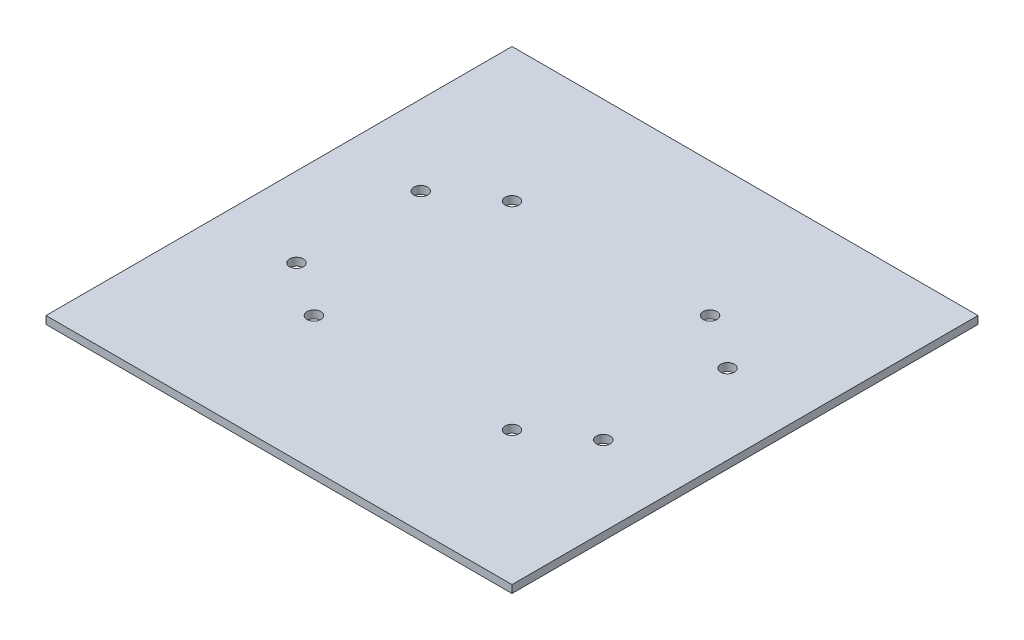
ISO-10303-21;
HEADER;
FILE_DESCRIPTION(('STEP AP214'),'2;1');
FILE_NAME('part.step','',(''),(''),'','','');
FILE_SCHEMA(('AUTOMOTIVE_DESIGN { 1 0 10303 214 1 1 1 1 }'));
ENDSEC;
DATA;
#1=APPLICATION_CONTEXT('core data for automotive mechanical design processes');
#2=APPLICATION_PROTOCOL_DEFINITION('international standard','automotive_design',2000,#1);
#3=PRODUCT_CONTEXT('',#1,'mechanical');
#4=PRODUCT('Part','Part','',(#3));
#5=PRODUCT_RELATED_PRODUCT_CATEGORY('part','',(#4));
#6=PRODUCT_DEFINITION_FORMATION('','',#4);
#7=PRODUCT_DEFINITION_CONTEXT('part definition',#1,'design');
#8=PRODUCT_DEFINITION('design','',#6,#7);
#9=PRODUCT_DEFINITION_SHAPE('','',#8);
#10=(LENGTH_UNIT() NAMED_UNIT(*) SI_UNIT(.MILLI.,.METRE.));
#11=(NAMED_UNIT(*) PLANE_ANGLE_UNIT() SI_UNIT($,.RADIAN.));
#12=(NAMED_UNIT(*) SI_UNIT($,.STERADIAN.) SOLID_ANGLE_UNIT());
#13=UNCERTAINTY_MEASURE_WITH_UNIT(LENGTH_MEASURE(1.E-05),#10,'distance_accuracy_value','');
#14=(GEOMETRIC_REPRESENTATION_CONTEXT(3) GLOBAL_UNCERTAINTY_ASSIGNED_CONTEXT((#13)) GLOBAL_UNIT_ASSIGNED_CONTEXT((#10,
#11,#12)) REPRESENTATION_CONTEXT('',''));
#15=CARTESIAN_POINT('',(0.,0.,0.));
#16=DIRECTION('',(0.,0.,1.));
#17=DIRECTION('',(1.,0.,0.));
#18=AXIS2_PLACEMENT_3D('',#15,#16,#17);
#19=CARTESIAN_POINT('',(44.8799955021159,2.,-74.7331424372196));
#20=DIRECTION('',(1.,0.,0.));
#21=DIRECTION('',(0.,0.,-1.));
#22=AXIS2_PLACEMENT_3D('',#19,#20,#21);
#23=PLANE('',#22);
#24=DIRECTION('',(0.,0.,1.));
#25=VECTOR('',#24,1.);
#26=CARTESIAN_POINT('',(44.8799955021159,0.,-74.7331424372196));
#27=LINE('',#26,#25);
#28=CARTESIAN_POINT('',(44.8799955021159,0.,-74.7331424372196));
#29=VERTEX_POINT('',#28);
#30=CARTESIAN_POINT('',(44.879995502116,0.,45.2668575627803));
#31=VERTEX_POINT('',#30);
#32=EDGE_CURVE('E95',#29,#31,#27,.T.);
#33=ORIENTED_EDGE('',*,*,#32,.T.);
#34=DIRECTION('',(0.,-1.,0.));
#35=VECTOR('',#34,1.);
#36=CARTESIAN_POINT('',(44.879995502116,2.,45.2668575627803));
#37=LINE('',#36,#35);
#38=CARTESIAN_POINT('',(44.879995502116,2.,45.2668575627803));
#39=VERTEX_POINT('',#38);
#40=EDGE_CURVE('E11',#39,#31,#37,.T.);
#41=ORIENTED_EDGE('',*,*,#40,.F.);
#42=DIRECTION('',(0.,0.,1.));
#43=VECTOR('',#42,1.);
#44=CARTESIAN_POINT('',(44.8799955021159,2.,-74.7331424372196));
#45=LINE('',#44,#43);
#46=CARTESIAN_POINT('',(44.8799955021159,2.,-74.7331424372196));
#47=VERTEX_POINT('',#46);
#48=EDGE_CURVE('E83',#47,#39,#45,.T.);
#49=ORIENTED_EDGE('',*,*,#48,.F.);
#50=DIRECTION('',(0.,-1.,0.));
#51=VECTOR('',#50,1.);
#52=CARTESIAN_POINT('',(44.8799955021159,2.,-74.7331424372196));
#53=LINE('',#52,#51);
#54=EDGE_CURVE('E91',#47,#29,#53,.T.);
#55=ORIENTED_EDGE('',*,*,#54,.T.);
#56=EDGE_LOOP('',(#33,#41,#49,#55));
#57=FACE_BOUND('',#56,.T.);
#58=ADVANCED_FACE('F32',(#57),#23,.F.);
#59=CARTESIAN_POINT('',(44.879995502116,2.,45.2668575627803));
#60=DIRECTION('',(0.,0.,-1.));
#61=DIRECTION('',(-1.,0.,0.));
#62=AXIS2_PLACEMENT_3D('',#59,#60,#61);
#63=PLANE('',#62);
#64=DIRECTION('',(1.,0.,0.));
#65=VECTOR('',#64,1.);
#66=CARTESIAN_POINT('',(44.879995502116,0.,45.2668575627803));
#67=LINE('',#66,#65);
#68=CARTESIAN_POINT('',(164.879995502116,0.,45.2668575627803));
#69=VERTEX_POINT('',#68);
#70=EDGE_CURVE('E87',#31,#69,#67,.T.);
#71=ORIENTED_EDGE('',*,*,#70,.T.);
#72=DIRECTION('',(0.,-1.,0.));
#73=VECTOR('',#72,1.);
#74=CARTESIAN_POINT('',(164.879995502116,2.,45.2668575627803));
#75=LINE('',#74,#73);
#76=CARTESIAN_POINT('',(164.879995502116,2.,45.2668575627803));
#77=VERTEX_POINT('',#76);
#78=EDGE_CURVE('E40',#77,#69,#75,.T.);
#79=ORIENTED_EDGE('',*,*,#78,.F.);
#80=DIRECTION('',(1.,0.,0.));
#81=VECTOR('',#80,1.);
#82=CARTESIAN_POINT('',(44.879995502116,2.,45.2668575627803));
#83=LINE('',#82,#81);
#84=EDGE_CURVE('E78',#39,#77,#83,.T.);
#85=ORIENTED_EDGE('',*,*,#84,.F.);
#86=ORIENTED_EDGE('',*,*,#40,.T.);
#87=EDGE_LOOP('',(#71,#79,#85,#86));
#88=FACE_BOUND('',#87,.T.);
#89=ADVANCED_FACE('F86',(#88),#63,.F.);
#90=CARTESIAN_POINT('',(164.879995502116,2.,-74.7331424372197));
#91=DIRECTION('',(-1.,0.,0.));
#92=DIRECTION('',(0.,0.,1.));
#93=AXIS2_PLACEMENT_3D('',#90,#91,#92);
#94=PLANE('',#93);
#95=DIRECTION('',(0.,0.,-1.));
#96=VECTOR('',#95,1.);
#97=CARTESIAN_POINT('',(164.879995502116,0.,-74.7331424372197));
#98=LINE('',#97,#96);
#99=CARTESIAN_POINT('',(164.879995502116,0.,-74.7331424372197));
#100=VERTEX_POINT('',#99);
#101=EDGE_CURVE('E65',#69,#100,#98,.T.);
#102=ORIENTED_EDGE('',*,*,#101,.T.);
#103=DIRECTION('',(0.,-1.,0.));
#104=VECTOR('',#103,1.);
#105=CARTESIAN_POINT('',(164.879995502116,2.,-74.7331424372197));
#106=LINE('',#105,#104);
#107=CARTESIAN_POINT('',(164.879995502116,2.,-74.7331424372197));
#108=VERTEX_POINT('',#107);
#109=EDGE_CURVE('E88',#108,#100,#106,.T.);
#110=ORIENTED_EDGE('',*,*,#109,.F.);
#111=DIRECTION('',(0.,0.,-1.));
#112=VECTOR('',#111,1.);
#113=CARTESIAN_POINT('',(164.879995502116,2.,-74.7331424372197));
#114=LINE('',#113,#112);
#115=EDGE_CURVE('E81',#77,#108,#114,.T.);
#116=ORIENTED_EDGE('',*,*,#115,.F.);
#117=ORIENTED_EDGE('',*,*,#78,.T.);
#118=EDGE_LOOP('',(#102,#110,#116,#117));
#119=FACE_BOUND('',#118,.T.);
#120=ADVANCED_FACE('F89',(#119),#94,.F.);
#121=CARTESIAN_POINT('',(44.8799955021159,2.,-74.7331424372196));
#122=DIRECTION('',(0.,0.,1.));
#123=DIRECTION('',(1.,0.,0.));
#124=AXIS2_PLACEMENT_3D('',#121,#122,#123);
#125=PLANE('',#124);
#126=DIRECTION('',(-1.,0.,0.));
#127=VECTOR('',#126,1.);
#128=CARTESIAN_POINT('',(44.8799955021159,0.,-74.7331424372196));
#129=LINE('',#128,#127);
#130=EDGE_CURVE('E71',#100,#29,#129,.T.);
#131=ORIENTED_EDGE('',*,*,#130,.T.);
#132=ORIENTED_EDGE('',*,*,#54,.F.);
#133=DIRECTION('',(-1.,0.,0.));
#134=VECTOR('',#133,1.);
#135=CARTESIAN_POINT('',(44.8799955021159,2.,-74.7331424372196));
#136=LINE('',#135,#134);
#137=EDGE_CURVE('E48',#108,#47,#136,.T.);
#138=ORIENTED_EDGE('',*,*,#137,.F.);
#139=ORIENTED_EDGE('',*,*,#109,.T.);
#140=EDGE_LOOP('',(#131,#132,#138,#139));
#141=FACE_BOUND('',#140,.T.);
#142=ADVANCED_FACE('F103',(#141),#125,.F.);
#143=CARTESIAN_POINT('',(0.,2.,0.));
#144=DIRECTION('',(0.,1.,0.));
#145=DIRECTION('',(0.,0.,1.));
#146=AXIS2_PLACEMENT_3D('',#143,#144,#145);
#147=PLANE('',#146);
#148=CARTESIAN_POINT('',(130.379995502116,2.,-40.2331424372197));
#149=DIRECTION('',(0.,1.,0.));
#150=DIRECTION('',(0.,0.,1.));
#151=AXIS2_PLACEMENT_3D('',#148,#149,#150);
#152=CIRCLE('',#151,1.77499999999999);
#153=CARTESIAN_POINT('',(130.379995502116,2.,-38.4581424372197));
#154=VERTEX_POINT('',#153);
#155=EDGE_CURVE('E151',#154,#154,#152,.T.);
#156=ORIENTED_EDGE('',*,*,#155,.F.);
#157=EDGE_LOOP('',(#156));
#158=FACE_BOUND('',#157,.T.);
#159=CARTESIAN_POINT('',(130.379995502116,2.,10.7668575627803));
#160=DIRECTION('',(0.,1.,0.));
#161=DIRECTION('',(0.,0.,1.));
#162=AXIS2_PLACEMENT_3D('',#159,#160,#161);
#163=CIRCLE('',#162,1.775);
#164=CARTESIAN_POINT('',(130.379995502116,2.,12.5418575627803));
#165=VERTEX_POINT('',#164);
#166=EDGE_CURVE('E145',#165,#165,#163,.T.);
#167=ORIENTED_EDGE('',*,*,#166,.F.);
#168=EDGE_LOOP('',(#167));
#169=FACE_BOUND('',#168,.T.);
#170=CARTESIAN_POINT('',(79.3799955021159,2.,-40.2331424372197));
#171=DIRECTION('',(0.,1.,0.));
#172=DIRECTION('',(0.,0.,1.));
#173=AXIS2_PLACEMENT_3D('',#170,#171,#172);
#174=CIRCLE('',#173,1.77499999999999);
#175=CARTESIAN_POINT('',(79.3799955021159,2.,-38.4581424372197));
#176=VERTEX_POINT('',#175);
#177=EDGE_CURVE('E139',#176,#176,#174,.T.);
#178=ORIENTED_EDGE('',*,*,#177,.F.);
#179=EDGE_LOOP('',(#178));
#180=FACE_BOUND('',#179,.T.);
#181=CARTESIAN_POINT('',(79.3799955021159,2.,10.7668575627803));
#182=DIRECTION('',(0.,1.,0.));
#183=DIRECTION('',(0.,0.,1.));
#184=AXIS2_PLACEMENT_3D('',#181,#182,#183);
#185=CIRCLE('',#184,1.775);
#186=CARTESIAN_POINT('',(79.3799955021159,2.,12.5418575627803));
#187=VERTEX_POINT('',#186);
#188=EDGE_CURVE('E133',#187,#187,#185,.T.);
#189=ORIENTED_EDGE('',*,*,#188,.F.);
#190=EDGE_LOOP('',(#189));
#191=FACE_BOUND('',#190,.T.);
#192=CARTESIAN_POINT('',(144.379995502116,2.,-30.7331424372197));
#193=DIRECTION('',(0.,1.,0.));
#194=DIRECTION('',(0.,0.,1.));
#195=AXIS2_PLACEMENT_3D('',#192,#193,#194);
#196=CIRCLE('',#195,1.77499999999999);
#197=CARTESIAN_POINT('',(144.379995502116,2.,-28.9581424372197));
#198=VERTEX_POINT('',#197);
#199=EDGE_CURVE('E127',#198,#198,#196,.T.);
#200=ORIENTED_EDGE('',*,*,#199,.F.);
#201=EDGE_LOOP('',(#200));
#202=FACE_BOUND('',#201,.T.);
#203=CARTESIAN_POINT('',(144.379995502116,2.,1.2668575627803));
#204=DIRECTION('',(0.,1.,0.));
#205=DIRECTION('',(0.,0.,1.));
#206=AXIS2_PLACEMENT_3D('',#203,#204,#205);
#207=CIRCLE('',#206,1.775);
#208=CARTESIAN_POINT('',(144.379995502116,2.,3.0418575627803));
#209=VERTEX_POINT('',#208);
#210=EDGE_CURVE('E121',#209,#209,#207,.T.);
#211=ORIENTED_EDGE('',*,*,#210,.F.);
#212=EDGE_LOOP('',(#211));
#213=FACE_BOUND('',#212,.T.);
#214=CARTESIAN_POINT('',(65.3799955021159,2.,1.2668575627803));
#215=DIRECTION('',(0.,1.,0.));
#216=DIRECTION('',(0.,0.,1.));
#217=AXIS2_PLACEMENT_3D('',#214,#215,#216);
#218=CIRCLE('',#217,1.775);
#219=CARTESIAN_POINT('',(65.3799955021159,2.,3.0418575627803));
#220=VERTEX_POINT('',#219);
#221=EDGE_CURVE('E115',#220,#220,#218,.T.);
#222=ORIENTED_EDGE('',*,*,#221,.F.);
#223=EDGE_LOOP('',(#222));
#224=FACE_BOUND('',#223,.T.);
#225=CARTESIAN_POINT('',(65.3799955021159,2.,-30.7331424372197));
#226=DIRECTION('',(0.,1.,0.));
#227=DIRECTION('',(0.,0.,1.));
#228=AXIS2_PLACEMENT_3D('',#225,#226,#227);
#229=CIRCLE('',#228,1.77499999999999);
#230=CARTESIAN_POINT('',(65.3799955021159,2.,-28.9581424372197));
#231=VERTEX_POINT('',#230);
#232=EDGE_CURVE('E109',#231,#231,#229,.T.);
#233=ORIENTED_EDGE('',*,*,#232,.F.);
#234=EDGE_LOOP('',(#233));
#235=FACE_BOUND('',#234,.T.);
#236=ORIENTED_EDGE('',*,*,#48,.T.);
#237=ORIENTED_EDGE('',*,*,#84,.T.);
#238=ORIENTED_EDGE('',*,*,#115,.T.);
#239=ORIENTED_EDGE('',*,*,#137,.T.);
#240=EDGE_LOOP('',(#236,#237,#238,#239));
#241=FACE_BOUND('',#240,.T.);
#242=ADVANCED_FACE('F79',(#158,#169,#180,#191,#202,#213,#224,#235,#241),#147,.T.);
#243=CARTESIAN_POINT('',(0.,0.,0.));
#244=DIRECTION('',(0.,1.,0.));
#245=DIRECTION('',(0.,0.,1.));
#246=AXIS2_PLACEMENT_3D('',#243,#244,#245);
#247=PLANE('',#246);
#248=CARTESIAN_POINT('',(130.379995502116,0.,-40.2331424372197));
#249=DIRECTION('',(0.,1.,0.));
#250=DIRECTION('',(0.,0.,1.));
#251=AXIS2_PLACEMENT_3D('',#248,#249,#250);
#252=CIRCLE('',#251,1.77499999999999);
#253=CARTESIAN_POINT('',(130.379995502116,0.,-38.4581424372197));
#254=VERTEX_POINT('',#253);
#255=EDGE_CURVE('E148',#254,#254,#252,.T.);
#256=ORIENTED_EDGE('',*,*,#255,.T.);
#257=EDGE_LOOP('',(#256));
#258=FACE_BOUND('',#257,.T.);
#259=CARTESIAN_POINT('',(130.379995502116,0.,10.7668575627803));
#260=DIRECTION('',(0.,1.,0.));
#261=DIRECTION('',(0.,0.,1.));
#262=AXIS2_PLACEMENT_3D('',#259,#260,#261);
#263=CIRCLE('',#262,1.775);
#264=CARTESIAN_POINT('',(130.379995502116,0.,12.5418575627803));
#265=VERTEX_POINT('',#264);
#266=EDGE_CURVE('E142',#265,#265,#263,.T.);
#267=ORIENTED_EDGE('',*,*,#266,.T.);
#268=EDGE_LOOP('',(#267));
#269=FACE_BOUND('',#268,.T.);
#270=CARTESIAN_POINT('',(79.3799955021159,0.,-40.2331424372197));
#271=DIRECTION('',(0.,1.,0.));
#272=DIRECTION('',(0.,0.,1.));
#273=AXIS2_PLACEMENT_3D('',#270,#271,#272);
#274=CIRCLE('',#273,1.77499999999999);
#275=CARTESIAN_POINT('',(79.3799955021159,0.,-38.4581424372197));
#276=VERTEX_POINT('',#275);
#277=EDGE_CURVE('E136',#276,#276,#274,.T.);
#278=ORIENTED_EDGE('',*,*,#277,.T.);
#279=EDGE_LOOP('',(#278));
#280=FACE_BOUND('',#279,.T.);
#281=CARTESIAN_POINT('',(79.3799955021159,0.,10.7668575627803));
#282=DIRECTION('',(0.,1.,0.));
#283=DIRECTION('',(0.,0.,1.));
#284=AXIS2_PLACEMENT_3D('',#281,#282,#283);
#285=CIRCLE('',#284,1.775);
#286=CARTESIAN_POINT('',(79.3799955021159,0.,12.5418575627803));
#287=VERTEX_POINT('',#286);
#288=EDGE_CURVE('E130',#287,#287,#285,.T.);
#289=ORIENTED_EDGE('',*,*,#288,.T.);
#290=EDGE_LOOP('',(#289));
#291=FACE_BOUND('',#290,.T.);
#292=CARTESIAN_POINT('',(144.379995502116,0.,-30.7331424372197));
#293=DIRECTION('',(0.,1.,0.));
#294=DIRECTION('',(0.,0.,1.));
#295=AXIS2_PLACEMENT_3D('',#292,#293,#294);
#296=CIRCLE('',#295,1.77499999999999);
#297=CARTESIAN_POINT('',(144.379995502116,0.,-28.9581424372197));
#298=VERTEX_POINT('',#297);
#299=EDGE_CURVE('E124',#298,#298,#296,.T.);
#300=ORIENTED_EDGE('',*,*,#299,.T.);
#301=EDGE_LOOP('',(#300));
#302=FACE_BOUND('',#301,.T.);
#303=CARTESIAN_POINT('',(144.379995502116,0.,1.2668575627803));
#304=DIRECTION('',(0.,1.,0.));
#305=DIRECTION('',(0.,0.,1.));
#306=AXIS2_PLACEMENT_3D('',#303,#304,#305);
#307=CIRCLE('',#306,1.775);
#308=CARTESIAN_POINT('',(144.379995502116,0.,3.0418575627803));
#309=VERTEX_POINT('',#308);
#310=EDGE_CURVE('E118',#309,#309,#307,.T.);
#311=ORIENTED_EDGE('',*,*,#310,.T.);
#312=EDGE_LOOP('',(#311));
#313=FACE_BOUND('',#312,.T.);
#314=CARTESIAN_POINT('',(65.3799955021159,0.,1.2668575627803));
#315=DIRECTION('',(0.,1.,0.));
#316=DIRECTION('',(0.,0.,1.));
#317=AXIS2_PLACEMENT_3D('',#314,#315,#316);
#318=CIRCLE('',#317,1.775);
#319=CARTESIAN_POINT('',(65.3799955021159,0.,3.0418575627803));
#320=VERTEX_POINT('',#319);
#321=EDGE_CURVE('E112',#320,#320,#318,.T.);
#322=ORIENTED_EDGE('',*,*,#321,.T.);
#323=EDGE_LOOP('',(#322));
#324=FACE_BOUND('',#323,.T.);
#325=CARTESIAN_POINT('',(65.3799955021159,0.,-30.7331424372197));
#326=DIRECTION('',(0.,1.,0.));
#327=DIRECTION('',(0.,0.,1.));
#328=AXIS2_PLACEMENT_3D('',#325,#326,#327);
#329=CIRCLE('',#328,1.77499999999999);
#330=CARTESIAN_POINT('',(65.3799955021159,0.,-28.9581424372197));
#331=VERTEX_POINT('',#330);
#332=EDGE_CURVE('E98',#331,#331,#329,.T.);
#333=ORIENTED_EDGE('',*,*,#332,.T.);
#334=EDGE_LOOP('',(#333));
#335=FACE_BOUND('',#334,.T.);
#336=ORIENTED_EDGE('',*,*,#32,.F.);
#337=ORIENTED_EDGE('',*,*,#130,.F.);
#338=ORIENTED_EDGE('',*,*,#101,.F.);
#339=ORIENTED_EDGE('',*,*,#70,.F.);
#340=EDGE_LOOP('',(#336,#337,#338,#339));
#341=FACE_BOUND('',#340,.T.);
#342=ADVANCED_FACE('F106',(#258,#269,#280,#291,#302,#313,#324,#335,#341),#247,.F.);
#343=CARTESIAN_POINT('',(65.3799955021159,0.,-30.7331424372197));
#344=DIRECTION('',(0.,1.,0.));
#345=DIRECTION('',(0.,0.,1.));
#346=AXIS2_PLACEMENT_3D('',#343,#344,#345);
#347=CYLINDRICAL_SURFACE('',#346,1.77499999999999);
#348=ORIENTED_EDGE('',*,*,#332,.F.);
#349=EDGE_LOOP('',(#348));
#350=FACE_BOUND('',#349,.T.);
#351=ORIENTED_EDGE('',*,*,#232,.T.);
#352=EDGE_LOOP('',(#351));
#353=FACE_BOUND('',#352,.T.);
#354=ADVANCED_FACE('F183',(#350,#353),#347,.F.);
#355=CARTESIAN_POINT('',(65.3799955021159,0.,1.2668575627803));
#356=DIRECTION('',(0.,1.,0.));
#357=DIRECTION('',(0.,0.,1.));
#358=AXIS2_PLACEMENT_3D('',#355,#356,#357);
#359=CYLINDRICAL_SURFACE('',#358,1.775);
#360=ORIENTED_EDGE('',*,*,#321,.F.);
#361=EDGE_LOOP('',(#360));
#362=FACE_BOUND('',#361,.T.);
#363=ORIENTED_EDGE('',*,*,#221,.T.);
#364=EDGE_LOOP('',(#363));
#365=FACE_BOUND('',#364,.T.);
#366=ADVANCED_FACE('F185',(#362,#365),#359,.F.);
#367=CARTESIAN_POINT('',(144.379995502116,0.,1.2668575627803));
#368=DIRECTION('',(0.,1.,0.));
#369=DIRECTION('',(0.,0.,1.));
#370=AXIS2_PLACEMENT_3D('',#367,#368,#369);
#371=CYLINDRICAL_SURFACE('',#370,1.775);
#372=ORIENTED_EDGE('',*,*,#310,.F.);
#373=EDGE_LOOP('',(#372));
#374=FACE_BOUND('',#373,.T.);
#375=ORIENTED_EDGE('',*,*,#210,.T.);
#376=EDGE_LOOP('',(#375));
#377=FACE_BOUND('',#376,.T.);
#378=ADVANCED_FACE('F192',(#374,#377),#371,.F.);
#379=CARTESIAN_POINT('',(144.379995502116,0.,-30.7331424372197));
#380=DIRECTION('',(0.,1.,0.));
#381=DIRECTION('',(0.,0.,1.));
#382=AXIS2_PLACEMENT_3D('',#379,#380,#381);
#383=CYLINDRICAL_SURFACE('',#382,1.77499999999999);
#384=ORIENTED_EDGE('',*,*,#299,.F.);
#385=EDGE_LOOP('',(#384));
#386=FACE_BOUND('',#385,.T.);
#387=ORIENTED_EDGE('',*,*,#199,.T.);
#388=EDGE_LOOP('',(#387));
#389=FACE_BOUND('',#388,.T.);
#390=ADVANCED_FACE('F232',(#386,#389),#383,.F.);
#391=CARTESIAN_POINT('',(79.3799955021159,0.,10.7668575627803));
#392=DIRECTION('',(0.,1.,0.));
#393=DIRECTION('',(0.,0.,1.));
#394=AXIS2_PLACEMENT_3D('',#391,#392,#393);
#395=CYLINDRICAL_SURFACE('',#394,1.775);
#396=ORIENTED_EDGE('',*,*,#288,.F.);
#397=EDGE_LOOP('',(#396));
#398=FACE_BOUND('',#397,.T.);
#399=ORIENTED_EDGE('',*,*,#188,.T.);
#400=EDGE_LOOP('',(#399));
#401=FACE_BOUND('',#400,.T.);
#402=ADVANCED_FACE('F226',(#398,#401),#395,.F.);
#403=CARTESIAN_POINT('',(79.3799955021159,0.,-40.2331424372197));
#404=DIRECTION('',(0.,1.,0.));
#405=DIRECTION('',(0.,0.,1.));
#406=AXIS2_PLACEMENT_3D('',#403,#404,#405);
#407=CYLINDRICAL_SURFACE('',#406,1.77499999999999);
#408=ORIENTED_EDGE('',*,*,#277,.F.);
#409=EDGE_LOOP('',(#408));
#410=FACE_BOUND('',#409,.T.);
#411=ORIENTED_EDGE('',*,*,#177,.T.);
#412=EDGE_LOOP('',(#411));
#413=FACE_BOUND('',#412,.T.);
#414=ADVANCED_FACE('F231',(#410,#413),#407,.F.);
#415=CARTESIAN_POINT('',(130.379995502116,0.,10.7668575627803));
#416=DIRECTION('',(0.,1.,0.));
#417=DIRECTION('',(0.,0.,1.));
#418=AXIS2_PLACEMENT_3D('',#415,#416,#417);
#419=CYLINDRICAL_SURFACE('',#418,1.775);
#420=ORIENTED_EDGE('',*,*,#266,.F.);
#421=EDGE_LOOP('',(#420));
#422=FACE_BOUND('',#421,.T.);
#423=ORIENTED_EDGE('',*,*,#166,.T.);
#424=EDGE_LOOP('',(#423));
#425=FACE_BOUND('',#424,.T.);
#426=ADVANCED_FACE('F162',(#422,#425),#419,.F.);
#427=CARTESIAN_POINT('',(130.379995502116,0.,-40.2331424372197));
#428=DIRECTION('',(0.,1.,0.));
#429=DIRECTION('',(0.,0.,1.));
#430=AXIS2_PLACEMENT_3D('',#427,#428,#429);
#431=CYLINDRICAL_SURFACE('',#430,1.77499999999999);
#432=ORIENTED_EDGE('',*,*,#255,.F.);
#433=EDGE_LOOP('',(#432));
#434=FACE_BOUND('',#433,.T.);
#435=ORIENTED_EDGE('',*,*,#155,.T.);
#436=EDGE_LOOP('',(#435));
#437=FACE_BOUND('',#436,.T.);
#438=ADVANCED_FACE('F159',(#434,#437),#431,.F.);
#439=CLOSED_SHELL('',(#58,#89,#120,#142,#242,#342,#354,#366,#378,#390,#402,#414,#426,#438));
#440=MANIFOLD_SOLID_BREP('B2',#439);
#441=ADVANCED_BREP_SHAPE_REPRESENTATION('',(#18,#440),#14);
#442=SHAPE_DEFINITION_REPRESENTATION(#9,#441);
ENDSEC;
END-ISO-10303-21;
